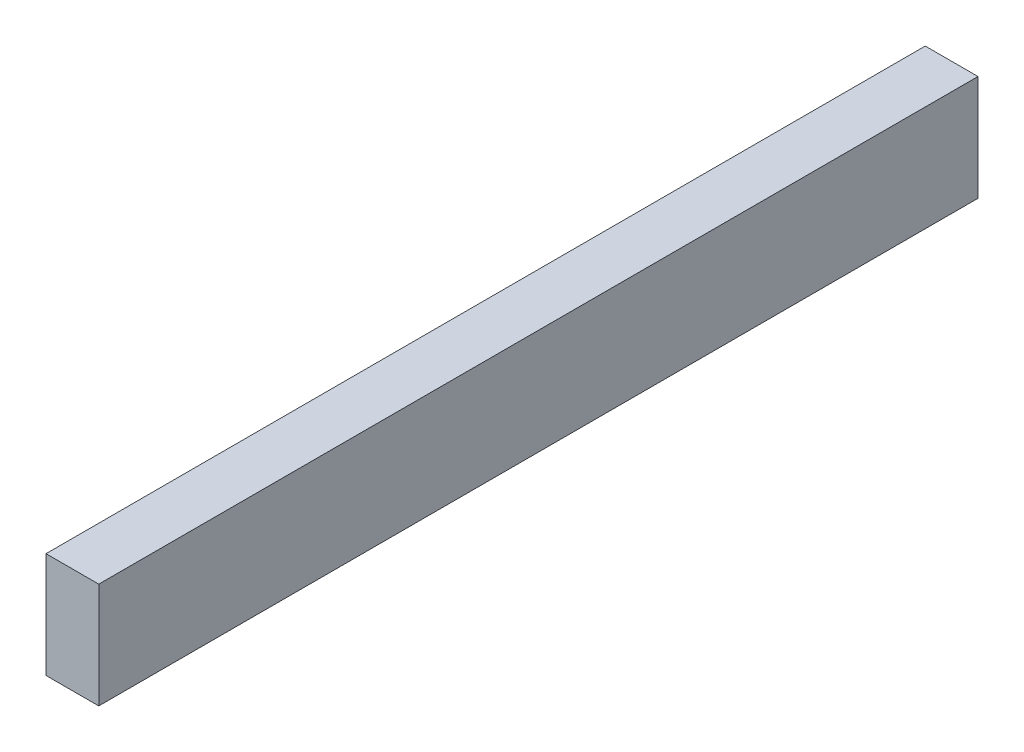
ISO-10303-21;
HEADER;
FILE_DESCRIPTION(('STEP AP214'),'2;1');
FILE_NAME('part.step','',(''),(''),'','','');
FILE_SCHEMA(('AUTOMOTIVE_DESIGN { 1 0 10303 214 1 1 1 1 }'));
ENDSEC;
DATA;
#1=APPLICATION_CONTEXT('core data for automotive mechanical design processes');
#2=APPLICATION_PROTOCOL_DEFINITION('international standard','automotive_design',2000,#1);
#3=PRODUCT_CONTEXT('',#1,'mechanical');
#4=PRODUCT('Part','Part','',(#3));
#5=PRODUCT_RELATED_PRODUCT_CATEGORY('part','',(#4));
#6=PRODUCT_DEFINITION_FORMATION('','',#4);
#7=PRODUCT_DEFINITION_CONTEXT('part definition',#1,'design');
#8=PRODUCT_DEFINITION('design','',#6,#7);
#9=PRODUCT_DEFINITION_SHAPE('','',#8);
#10=(LENGTH_UNIT() NAMED_UNIT(*) SI_UNIT(.MILLI.,.METRE.));
#11=(NAMED_UNIT(*) PLANE_ANGLE_UNIT() SI_UNIT($,.RADIAN.));
#12=(NAMED_UNIT(*) SI_UNIT($,.STERADIAN.) SOLID_ANGLE_UNIT());
#13=UNCERTAINTY_MEASURE_WITH_UNIT(LENGTH_MEASURE(1.E-05),#10,'distance_accuracy_value','');
#14=(GEOMETRIC_REPRESENTATION_CONTEXT(3) GLOBAL_UNCERTAINTY_ASSIGNED_CONTEXT((#13)) GLOBAL_UNIT_ASSIGNED_CONTEXT((#10,
#11,#12)) REPRESENTATION_CONTEXT('',''));
#15=CARTESIAN_POINT('',(0.,0.,0.));
#16=DIRECTION('',(0.,0.,1.));
#17=DIRECTION('',(1.,0.,0.));
#18=AXIS2_PLACEMENT_3D('',#15,#16,#17);
#19=CARTESIAN_POINT('',(15.,-30.,250.));
#20=DIRECTION('',(-1.,0.,0.));
#21=DIRECTION('',(0.,0.,1.));
#22=AXIS2_PLACEMENT_3D('',#19,#20,#21);
#23=PLANE('',#22);
#24=DIRECTION('',(0.,1.,0.));
#25=VECTOR('',#24,1.);
#26=CARTESIAN_POINT('',(15.,-30.,-250.));
#27=LINE('',#26,#25);
#28=CARTESIAN_POINT('',(15.,-30.,-250.));
#29=VERTEX_POINT('',#28);
#30=CARTESIAN_POINT('',(15.,30.,-250.));
#31=VERTEX_POINT('',#30);
#32=EDGE_CURVE('E107',#29,#31,#27,.T.);
#33=ORIENTED_EDGE('',*,*,#32,.T.);
#34=DIRECTION('',(0.,0.,-1.));
#35=VECTOR('',#34,1.);
#36=CARTESIAN_POINT('',(15.,30.,250.));
#37=LINE('',#36,#35);
#38=CARTESIAN_POINT('',(15.,30.,250.));
#39=VERTEX_POINT('',#38);
#40=EDGE_CURVE('E11',#39,#31,#37,.T.);
#41=ORIENTED_EDGE('',*,*,#40,.F.);
#42=DIRECTION('',(0.,1.,0.));
#43=VECTOR('',#42,1.);
#44=CARTESIAN_POINT('',(15.,-30.,250.));
#45=LINE('',#44,#43);
#46=CARTESIAN_POINT('',(15.,-30.,250.));
#47=VERTEX_POINT('',#46);
#48=EDGE_CURVE('E91',#47,#39,#45,.T.);
#49=ORIENTED_EDGE('',*,*,#48,.F.);
#50=DIRECTION('',(0.,0.,-1.));
#51=VECTOR('',#50,1.);
#52=CARTESIAN_POINT('',(15.,-30.,250.));
#53=LINE('',#52,#51);
#54=EDGE_CURVE('E103',#47,#29,#53,.T.);
#55=ORIENTED_EDGE('',*,*,#54,.T.);
#56=EDGE_LOOP('',(#33,#41,#49,#55));
#57=FACE_BOUND('',#56,.T.);
#58=ADVANCED_FACE('F39',(#57),#23,.F.);
#59=CARTESIAN_POINT('',(-15.,30.,250.));
#60=DIRECTION('',(0.,-1.,0.));
#61=DIRECTION('',(0.,0.,-1.));
#62=AXIS2_PLACEMENT_3D('',#59,#60,#61);
#63=PLANE('',#62);
#64=DIRECTION('',(-1.,0.,0.));
#65=VECTOR('',#64,1.);
#66=CARTESIAN_POINT('',(-15.,30.,-250.));
#67=LINE('',#66,#65);
#68=CARTESIAN_POINT('',(-15.,30.,-250.));
#69=VERTEX_POINT('',#68);
#70=EDGE_CURVE('E96',#31,#69,#67,.T.);
#71=ORIENTED_EDGE('',*,*,#70,.T.);
#72=DIRECTION('',(0.,0.,-1.));
#73=VECTOR('',#72,1.);
#74=CARTESIAN_POINT('',(-15.,30.,250.));
#75=LINE('',#74,#73);
#76=CARTESIAN_POINT('',(-15.,30.,250.));
#77=VERTEX_POINT('',#76);
#78=EDGE_CURVE('E48',#77,#69,#75,.T.);
#79=ORIENTED_EDGE('',*,*,#78,.F.);
#80=DIRECTION('',(-1.,0.,0.));
#81=VECTOR('',#80,1.);
#82=CARTESIAN_POINT('',(-15.,30.,250.));
#83=LINE('',#82,#81);
#84=EDGE_CURVE('E86',#39,#77,#83,.T.);
#85=ORIENTED_EDGE('',*,*,#84,.F.);
#86=ORIENTED_EDGE('',*,*,#40,.T.);
#87=EDGE_LOOP('',(#71,#79,#85,#86));
#88=FACE_BOUND('',#87,.T.);
#89=ADVANCED_FACE('F95',(#88),#63,.F.);
#90=CARTESIAN_POINT('',(-15.,-30.,250.));
#91=DIRECTION('',(1.,0.,0.));
#92=DIRECTION('',(0.,0.,-1.));
#93=AXIS2_PLACEMENT_3D('',#90,#91,#92);
#94=PLANE('',#93);
#95=DIRECTION('',(0.,-1.,0.));
#96=VECTOR('',#95,1.);
#97=CARTESIAN_POINT('',(-15.,-30.,-250.));
#98=LINE('',#97,#96);
#99=CARTESIAN_POINT('',(-15.,-30.,-250.));
#100=VERTEX_POINT('',#99);
#101=EDGE_CURVE('E73',#69,#100,#98,.T.);
#102=ORIENTED_EDGE('',*,*,#101,.T.);
#103=DIRECTION('',(0.,0.,-1.));
#104=VECTOR('',#103,1.);
#105=CARTESIAN_POINT('',(-15.,-30.,250.));
#106=LINE('',#105,#104);
#107=CARTESIAN_POINT('',(-15.,-30.,250.));
#108=VERTEX_POINT('',#107);
#109=EDGE_CURVE('E98',#108,#100,#106,.T.);
#110=ORIENTED_EDGE('',*,*,#109,.F.);
#111=DIRECTION('',(0.,-1.,0.));
#112=VECTOR('',#111,1.);
#113=CARTESIAN_POINT('',(-15.,-30.,250.));
#114=LINE('',#113,#112);
#115=EDGE_CURVE('E89',#77,#108,#114,.T.);
#116=ORIENTED_EDGE('',*,*,#115,.F.);
#117=ORIENTED_EDGE('',*,*,#78,.T.);
#118=EDGE_LOOP('',(#102,#110,#116,#117));
#119=FACE_BOUND('',#118,.T.);
#120=ADVANCED_FACE('F99',(#119),#94,.F.);
#121=CARTESIAN_POINT('',(-15.,-30.,250.));
#122=DIRECTION('',(0.,1.,0.));
#123=DIRECTION('',(0.,0.,1.));
#124=AXIS2_PLACEMENT_3D('',#121,#122,#123);
#125=PLANE('',#124);
#126=DIRECTION('',(1.,0.,0.));
#127=VECTOR('',#126,1.);
#128=CARTESIAN_POINT('',(-15.,-30.,-250.));
#129=LINE('',#128,#127);
#130=EDGE_CURVE('E79',#100,#29,#129,.T.);
#131=ORIENTED_EDGE('',*,*,#130,.T.);
#132=ORIENTED_EDGE('',*,*,#54,.F.);
#133=DIRECTION('',(1.,0.,0.));
#134=VECTOR('',#133,1.);
#135=CARTESIAN_POINT('',(-15.,-30.,250.));
#136=LINE('',#135,#134);
#137=EDGE_CURVE('E56',#108,#47,#136,.T.);
#138=ORIENTED_EDGE('',*,*,#137,.F.);
#139=ORIENTED_EDGE('',*,*,#109,.T.);
#140=EDGE_LOOP('',(#131,#132,#138,#139));
#141=FACE_BOUND('',#140,.T.);
#142=ADVANCED_FACE('F120',(#141),#125,.F.);
#143=CARTESIAN_POINT('',(0.,0.,250.));
#144=DIRECTION('',(0.,0.,-1.));
#145=DIRECTION('',(-1.,0.,0.));
#146=AXIS2_PLACEMENT_3D('',#143,#144,#145);
#147=PLANE('',#146);
#148=ORIENTED_EDGE('',*,*,#48,.T.);
#149=ORIENTED_EDGE('',*,*,#84,.T.);
#150=ORIENTED_EDGE('',*,*,#115,.T.);
#151=ORIENTED_EDGE('',*,*,#137,.T.);
#152=EDGE_LOOP('',(#148,#149,#150,#151));
#153=FACE_BOUND('',#152,.T.);
#154=ADVANCED_FACE('F87',(#153),#147,.F.);
#155=CARTESIAN_POINT('',(0.,0.,-250.));
#156=DIRECTION('',(0.,0.,-1.));
#157=DIRECTION('',(-1.,0.,0.));
#158=AXIS2_PLACEMENT_3D('',#155,#156,#157);
#159=PLANE('',#158);
#160=ORIENTED_EDGE('',*,*,#32,.F.);
#161=ORIENTED_EDGE('',*,*,#130,.F.);
#162=ORIENTED_EDGE('',*,*,#101,.F.);
#163=ORIENTED_EDGE('',*,*,#70,.F.);
#164=EDGE_LOOP('',(#160,#161,#162,#163));
#165=FACE_BOUND('',#164,.T.);
#166=ADVANCED_FACE('F123',(#165),#159,.T.);
#167=CLOSED_SHELL('',(#58,#89,#120,#142,#154,#166));
#168=MANIFOLD_SOLID_BREP('B2',#167);
#169=ADVANCED_BREP_SHAPE_REPRESENTATION('',(#18,#168),#14);
#170=SHAPE_DEFINITION_REPRESENTATION(#9,#169);
ENDSEC;
END-ISO-10303-21;
